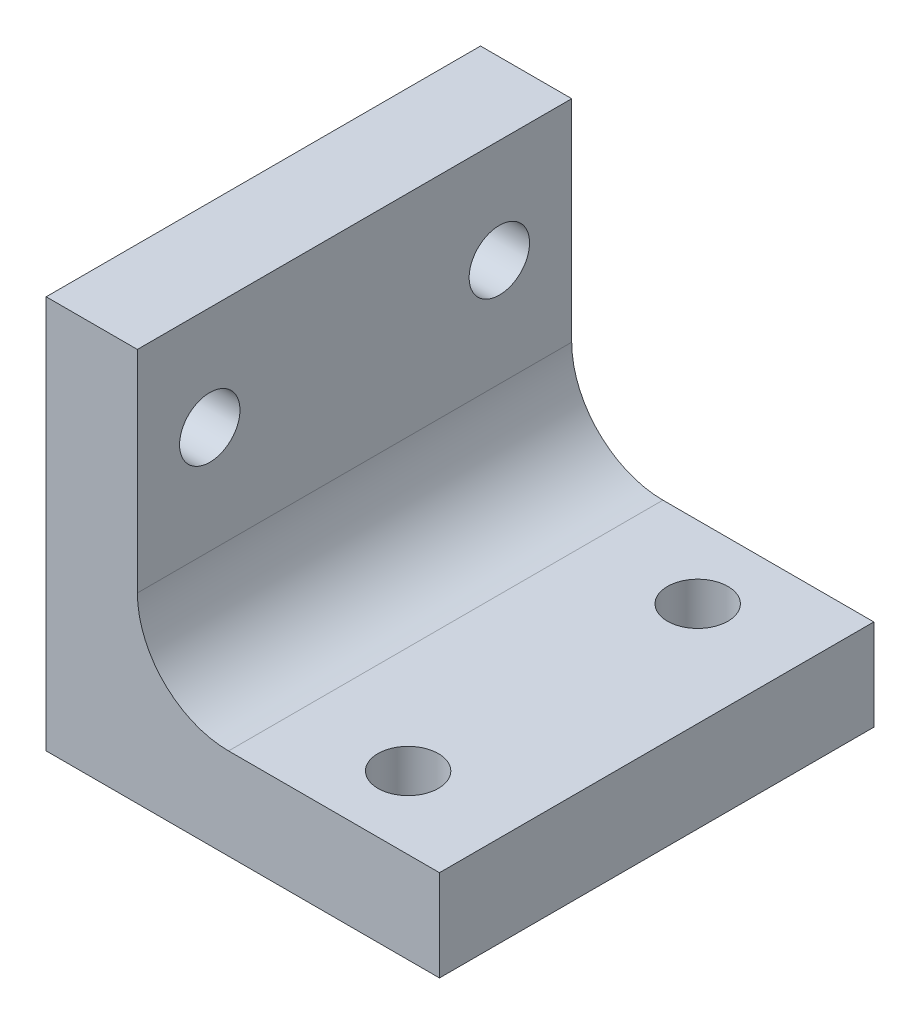
ISO-10303-21;
HEADER;
FILE_DESCRIPTION(('STEP AP214'),'2;1');
FILE_NAME('part.step','',(''),(''),'','','');
FILE_SCHEMA(('AUTOMOTIVE_DESIGN { 1 0 10303 214 1 1 1 1 }'));
ENDSEC;
DATA;
#1=APPLICATION_CONTEXT('core data for automotive mechanical design processes');
#2=APPLICATION_PROTOCOL_DEFINITION('international standard','automotive_design',2000,#1);
#3=PRODUCT_CONTEXT('',#1,'mechanical');
#4=PRODUCT('Part','Part','',(#3));
#5=PRODUCT_RELATED_PRODUCT_CATEGORY('part','',(#4));
#6=PRODUCT_DEFINITION_FORMATION('','',#4);
#7=PRODUCT_DEFINITION_CONTEXT('part definition',#1,'design');
#8=PRODUCT_DEFINITION('design','',#6,#7);
#9=PRODUCT_DEFINITION_SHAPE('','',#8);
#10=(LENGTH_UNIT() NAMED_UNIT(*) SI_UNIT(.MILLI.,.METRE.));
#11=(NAMED_UNIT(*) PLANE_ANGLE_UNIT() SI_UNIT($,.RADIAN.));
#12=(NAMED_UNIT(*) SI_UNIT($,.STERADIAN.) SOLID_ANGLE_UNIT());
#13=UNCERTAINTY_MEASURE_WITH_UNIT(LENGTH_MEASURE(1.E-05),#10,'distance_accuracy_value','');
#14=(GEOMETRIC_REPRESENTATION_CONTEXT(3) GLOBAL_UNCERTAINTY_ASSIGNED_CONTEXT((#13)) GLOBAL_UNIT_ASSIGNED_CONTEXT((#10,
#11,#12)) REPRESENTATION_CONTEXT('',''));
#15=CARTESIAN_POINT('',(0.,0.,0.));
#16=DIRECTION('',(0.,0.,1.));
#17=DIRECTION('',(1.,0.,0.));
#18=AXIS2_PLACEMENT_3D('',#15,#16,#17);
#19=CARTESIAN_POINT('',(0.,0.,19.05));
#20=DIRECTION('',(0.,1.,0.));
#21=DIRECTION('',(0.,0.,1.));
#22=AXIS2_PLACEMENT_3D('',#19,#20,#21);
#23=PLANE('',#22);
#24=CARTESIAN_POINT('',(25.4,0.,-12.7));
#25=DIRECTION('',(0.,1.,0.));
#26=DIRECTION('',(0.,0.,1.));
#27=AXIS2_PLACEMENT_3D('',#24,#25,#26);
#28=CIRCLE('',#27,2.65);
#29=CARTESIAN_POINT('',(25.4,0.,-10.05));
#30=VERTEX_POINT('',#29);
#31=EDGE_CURVE('E137',#30,#30,#28,.T.);
#32=ORIENTED_EDGE('',*,*,#31,.T.);
#33=EDGE_LOOP('',(#32));
#34=FACE_BOUND('',#33,.T.);
#35=CARTESIAN_POINT('',(25.4,0.,12.7));
#36=DIRECTION('',(0.,1.,0.));
#37=DIRECTION('',(0.,0.,1.));
#38=AXIS2_PLACEMENT_3D('',#35,#36,#37);
#39=CIRCLE('',#38,2.65);
#40=CARTESIAN_POINT('',(25.4,0.,15.35));
#41=VERTEX_POINT('',#40);
#42=EDGE_CURVE('E143',#41,#41,#39,.T.);
#43=ORIENTED_EDGE('',*,*,#42,.T.);
#44=EDGE_LOOP('',(#43));
#45=FACE_BOUND('',#44,.T.);
#46=DIRECTION('',(1.,0.,0.));
#47=VECTOR('',#46,1.);
#48=CARTESIAN_POINT('',(0.,0.,-19.05));
#49=LINE('',#48,#47);
#50=CARTESIAN_POINT('',(0.,0.,-19.05));
#51=VERTEX_POINT('',#50);
#52=CARTESIAN_POINT('',(34.5,0.,-19.05));
#53=VERTEX_POINT('',#52);
#54=EDGE_CURVE('E146',#51,#53,#49,.T.);
#55=ORIENTED_EDGE('',*,*,#54,.T.);
#56=DIRECTION('',(0.,0.,-1.));
#57=VECTOR('',#56,1.);
#58=CARTESIAN_POINT('',(34.5,0.,19.05));
#59=LINE('',#58,#57);
#60=CARTESIAN_POINT('',(34.5,0.,19.05));
#61=VERTEX_POINT('',#60);
#62=EDGE_CURVE('E161',#61,#53,#59,.T.);
#63=ORIENTED_EDGE('',*,*,#62,.F.);
#64=DIRECTION('',(1.,0.,0.));
#65=VECTOR('',#64,1.);
#66=CARTESIAN_POINT('',(0.,0.,19.05));
#67=LINE('',#66,#65);
#68=CARTESIAN_POINT('',(0.,0.,19.05));
#69=VERTEX_POINT('',#68);
#70=EDGE_CURVE('E147',#69,#61,#67,.T.);
#71=ORIENTED_EDGE('',*,*,#70,.F.);
#72=DIRECTION('',(0.,0.,-1.));
#73=VECTOR('',#72,1.);
#74=CARTESIAN_POINT('',(0.,0.,19.05));
#75=LINE('',#74,#73);
#76=EDGE_CURVE('E116',#69,#51,#75,.T.);
#77=ORIENTED_EDGE('',*,*,#76,.T.);
#78=EDGE_LOOP('',(#55,#63,#71,#77));
#79=FACE_BOUND('',#78,.T.);
#80=ADVANCED_FACE('F37',(#34,#45,#79),#23,.F.);
#81=CARTESIAN_POINT('',(34.5,0.,19.05));
#82=DIRECTION('',(-1.,0.,0.));
#83=DIRECTION('',(0.,0.,1.));
#84=AXIS2_PLACEMENT_3D('',#81,#82,#83);
#85=PLANE('',#84);
#86=DIRECTION('',(0.,1.,0.));
#87=VECTOR('',#86,1.);
#88=CARTESIAN_POINT('',(34.5,0.,-19.05));
#89=LINE('',#88,#87);
#90=CARTESIAN_POINT('',(34.5,8.,-19.05));
#91=VERTEX_POINT('',#90);
#92=EDGE_CURVE('E156',#53,#91,#89,.T.);
#93=ORIENTED_EDGE('',*,*,#92,.T.);
#94=DIRECTION('',(0.,0.,-1.));
#95=VECTOR('',#94,1.);
#96=CARTESIAN_POINT('',(34.5,8.,19.05));
#97=LINE('',#96,#95);
#98=CARTESIAN_POINT('',(34.5,8.,19.05));
#99=VERTEX_POINT('',#98);
#100=EDGE_CURVE('E154',#99,#91,#97,.T.);
#101=ORIENTED_EDGE('',*,*,#100,.F.);
#102=DIRECTION('',(0.,1.,0.));
#103=VECTOR('',#102,1.);
#104=CARTESIAN_POINT('',(34.5,0.,19.05));
#105=LINE('',#104,#103);
#106=EDGE_CURVE('E149',#61,#99,#105,.T.);
#107=ORIENTED_EDGE('',*,*,#106,.F.);
#108=ORIENTED_EDGE('',*,*,#62,.T.);
#109=EDGE_LOOP('',(#93,#101,#107,#108));
#110=FACE_BOUND('',#109,.T.);
#111=ADVANCED_FACE('F179',(#110),#85,.F.);
#112=CARTESIAN_POINT('',(34.5,8.,19.05));
#113=DIRECTION('',(0.,-1.,0.));
#114=DIRECTION('',(1.,0.,0.));
#115=AXIS2_PLACEMENT_3D('',#112,#113,#114);
#116=PLANE('',#115);
#117=CARTESIAN_POINT('',(25.4,8.,-12.7));
#118=DIRECTION('',(0.,1.,0.));
#119=DIRECTION('',(0.,0.,1.));
#120=AXIS2_PLACEMENT_3D('',#117,#118,#119);
#121=CIRCLE('',#120,2.65);
#122=CARTESIAN_POINT('',(25.4,8.,-10.05));
#123=VERTEX_POINT('',#122);
#124=EDGE_CURVE('E134',#123,#123,#121,.T.);
#125=ORIENTED_EDGE('',*,*,#124,.F.);
#126=EDGE_LOOP('',(#125));
#127=FACE_BOUND('',#126,.T.);
#128=CARTESIAN_POINT('',(25.4,8.,12.7));
#129=DIRECTION('',(0.,1.,0.));
#130=DIRECTION('',(0.,0.,1.));
#131=AXIS2_PLACEMENT_3D('',#128,#129,#130);
#132=CIRCLE('',#131,2.65);
#133=CARTESIAN_POINT('',(25.4,8.,15.35));
#134=VERTEX_POINT('',#133);
#135=EDGE_CURVE('E140',#134,#134,#132,.T.);
#136=ORIENTED_EDGE('',*,*,#135,.F.);
#137=EDGE_LOOP('',(#136));
#138=FACE_BOUND('',#137,.T.);
#139=DIRECTION('',(-1.,0.,0.));
#140=VECTOR('',#139,1.);
#141=CARTESIAN_POINT('',(34.5,8.,-19.05));
#142=LINE('',#141,#140);
#143=CARTESIAN_POINT('',(16.,8.,-19.05));
#144=VERTEX_POINT('',#143);
#145=EDGE_CURVE('E150',#91,#144,#142,.T.);
#146=ORIENTED_EDGE('',*,*,#145,.T.);
#147=DIRECTION('',(0.,0.,-1.));
#148=VECTOR('',#147,1.);
#149=CARTESIAN_POINT('',(16.,8.,19.05));
#150=LINE('',#149,#148);
#151=CARTESIAN_POINT('',(16.,8.,19.05));
#152=VERTEX_POINT('',#151);
#153=EDGE_CURVE('E52',#144,#152,#150,.F.);
#154=ORIENTED_EDGE('',*,*,#153,.T.);
#155=DIRECTION('',(-1.,0.,0.));
#156=VECTOR('',#155,1.);
#157=CARTESIAN_POINT('',(34.5,8.,19.05));
#158=LINE('',#157,#156);
#159=EDGE_CURVE('E152',#99,#152,#158,.T.);
#160=ORIENTED_EDGE('',*,*,#159,.F.);
#161=ORIENTED_EDGE('',*,*,#100,.T.);
#162=EDGE_LOOP('',(#146,#154,#160,#161));
#163=FACE_BOUND('',#162,.T.);
#164=ADVANCED_FACE('F180',(#127,#138,#163),#116,.F.);
#165=CARTESIAN_POINT('',(0.,0.,19.05));
#166=DIRECTION('',(0.,0.,1.));
#167=DIRECTION('',(1.,0.,0.));
#168=AXIS2_PLACEMENT_3D('',#165,#166,#167);
#169=PLANE('',#168);
#170=ORIENTED_EDGE('',*,*,#159,.T.);
#171=CARTESIAN_POINT('',(16.,16.,19.05));
#172=DIRECTION('',(0.,0.,1.));
#173=DIRECTION('',(1.,0.,0.));
#174=AXIS2_PLACEMENT_3D('',#171,#172,#173);
#175=CIRCLE('',#174,8.);
#176=CARTESIAN_POINT('',(8.,16.,19.05));
#177=VERTEX_POINT('',#176);
#178=EDGE_CURVE('E11',#152,#177,#175,.F.);
#179=ORIENTED_EDGE('',*,*,#178,.T.);
#180=DIRECTION('',(0.,-1.,0.));
#181=VECTOR('',#180,1.);
#182=CARTESIAN_POINT('',(8.00000000000001,34.5,19.05));
#183=LINE('',#182,#181);
#184=CARTESIAN_POINT('',(8.00000000000001,34.5,19.05));
#185=VERTEX_POINT('',#184);
#186=EDGE_CURVE('E103',#185,#177,#183,.T.);
#187=ORIENTED_EDGE('',*,*,#186,.F.);
#188=DIRECTION('',(1.,0.,0.));
#189=VECTOR('',#188,1.);
#190=CARTESIAN_POINT('',(0.,34.5,19.05));
#191=LINE('',#190,#189);
#192=CARTESIAN_POINT('',(0.,34.5,19.05));
#193=VERTEX_POINT('',#192);
#194=EDGE_CURVE('E96',#193,#185,#191,.T.);
#195=ORIENTED_EDGE('',*,*,#194,.F.);
#196=DIRECTION('',(0.,1.,0.));
#197=VECTOR('',#196,1.);
#198=CARTESIAN_POINT('',(0.,0.,19.05));
#199=LINE('',#198,#197);
#200=EDGE_CURVE('E100',#69,#193,#199,.T.);
#201=ORIENTED_EDGE('',*,*,#200,.F.);
#202=ORIENTED_EDGE('',*,*,#70,.T.);
#203=ORIENTED_EDGE('',*,*,#106,.T.);
#204=EDGE_LOOP('',(#170,#179,#187,#195,#201,#202,#203));
#205=FACE_BOUND('',#204,.T.);
#206=ADVANCED_FACE('F98',(#205),#169,.T.);
#207=CARTESIAN_POINT('',(0.,0.,-19.05));
#208=DIRECTION('',(0.,0.,1.));
#209=DIRECTION('',(1.,0.,0.));
#210=AXIS2_PLACEMENT_3D('',#207,#208,#209);
#211=PLANE('',#210);
#212=ORIENTED_EDGE('',*,*,#54,.F.);
#213=DIRECTION('',(0.,1.,0.));
#214=VECTOR('',#213,1.);
#215=CARTESIAN_POINT('',(0.,0.,-19.05));
#216=LINE('',#215,#214);
#217=CARTESIAN_POINT('',(0.,34.5,-19.05));
#218=VERTEX_POINT('',#217);
#219=EDGE_CURVE('E129',#51,#218,#216,.T.);
#220=ORIENTED_EDGE('',*,*,#219,.T.);
#221=DIRECTION('',(1.,0.,0.));
#222=VECTOR('',#221,1.);
#223=CARTESIAN_POINT('',(0.,34.5,-19.05));
#224=LINE('',#223,#222);
#225=CARTESIAN_POINT('',(8.00000000000001,34.5,-19.05));
#226=VERTEX_POINT('',#225);
#227=EDGE_CURVE('E112',#218,#226,#224,.T.);
#228=ORIENTED_EDGE('',*,*,#227,.T.);
#229=DIRECTION('',(0.,-1.,0.));
#230=VECTOR('',#229,1.);
#231=CARTESIAN_POINT('',(8.00000000000001,34.5,-19.05));
#232=LINE('',#231,#230);
#233=CARTESIAN_POINT('',(8.,16.,-19.05));
#234=VERTEX_POINT('',#233);
#235=EDGE_CURVE('E121',#226,#234,#232,.T.);
#236=ORIENTED_EDGE('',*,*,#235,.T.);
#237=CARTESIAN_POINT('',(16.,16.,-19.05));
#238=DIRECTION('',(0.,0.,1.));
#239=DIRECTION('',(1.,0.,0.));
#240=AXIS2_PLACEMENT_3D('',#237,#238,#239);
#241=CIRCLE('',#240,8.);
#242=EDGE_CURVE('E45',#234,#144,#241,.T.);
#243=ORIENTED_EDGE('',*,*,#242,.T.);
#244=ORIENTED_EDGE('',*,*,#145,.F.);
#245=ORIENTED_EDGE('',*,*,#92,.F.);
#246=EDGE_LOOP('',(#212,#220,#228,#236,#243,#244,#245));
#247=FACE_BOUND('',#246,.T.);
#248=ADVANCED_FACE('F172',(#247),#211,.F.);
#249=CARTESIAN_POINT('',(25.4,8.,12.7));
#250=DIRECTION('',(0.,1.,0.));
#251=DIRECTION('',(0.,0.,1.));
#252=AXIS2_PLACEMENT_3D('',#249,#250,#251);
#253=CYLINDRICAL_SURFACE('',#252,2.65);
#254=ORIENTED_EDGE('',*,*,#42,.F.);
#255=EDGE_LOOP('',(#254));
#256=FACE_BOUND('',#255,.T.);
#257=ORIENTED_EDGE('',*,*,#135,.T.);
#258=EDGE_LOOP('',(#257));
#259=FACE_BOUND('',#258,.T.);
#260=ADVANCED_FACE('F201',(#256,#259),#253,.F.);
#261=CARTESIAN_POINT('',(25.4,8.,-12.7));
#262=DIRECTION('',(0.,1.,0.));
#263=DIRECTION('',(0.,0.,1.));
#264=AXIS2_PLACEMENT_3D('',#261,#262,#263);
#265=CYLINDRICAL_SURFACE('',#264,2.65);
#266=ORIENTED_EDGE('',*,*,#31,.F.);
#267=EDGE_LOOP('',(#266));
#268=FACE_BOUND('',#267,.T.);
#269=ORIENTED_EDGE('',*,*,#124,.T.);
#270=EDGE_LOOP('',(#269));
#271=FACE_BOUND('',#270,.T.);
#272=ADVANCED_FACE('F204',(#268,#271),#265,.F.);
#273=CARTESIAN_POINT('',(0.,0.,19.05));
#274=DIRECTION('',(1.,0.,0.));
#275=DIRECTION('',(0.,0.,1.));
#276=AXIS2_PLACEMENT_3D('',#273,#274,#275);
#277=PLANE('',#276);
#278=CARTESIAN_POINT('',(0.,25.4,-12.7));
#279=DIRECTION('',(-1.,0.,0.));
#280=DIRECTION('',(0.,0.,1.));
#281=AXIS2_PLACEMENT_3D('',#278,#279,#280);
#282=CIRCLE('',#281,2.65);
#283=CARTESIAN_POINT('',(0.,25.4,-10.05));
#284=VERTEX_POINT('',#283);
#285=EDGE_CURVE('E235',#284,#284,#282,.T.);
#286=ORIENTED_EDGE('',*,*,#285,.F.);
#287=EDGE_LOOP('',(#286));
#288=FACE_BOUND('',#287,.T.);
#289=CARTESIAN_POINT('',(0.,25.4,12.7));
#290=DIRECTION('',(-1.,0.,0.));
#291=DIRECTION('',(0.,0.,1.));
#292=AXIS2_PLACEMENT_3D('',#289,#290,#291);
#293=CIRCLE('',#292,2.65);
#294=CARTESIAN_POINT('',(0.,25.4,15.35));
#295=VERTEX_POINT('',#294);
#296=EDGE_CURVE('E125',#295,#295,#293,.T.);
#297=ORIENTED_EDGE('',*,*,#296,.F.);
#298=EDGE_LOOP('',(#297));
#299=FACE_BOUND('',#298,.T.);
#300=ORIENTED_EDGE('',*,*,#219,.F.);
#301=ORIENTED_EDGE('',*,*,#76,.F.);
#302=ORIENTED_EDGE('',*,*,#200,.T.);
#303=DIRECTION('',(0.,0.,-1.));
#304=VECTOR('',#303,1.);
#305=CARTESIAN_POINT('',(0.,34.5,19.05));
#306=LINE('',#305,#304);
#307=EDGE_CURVE('E109',#193,#218,#306,.T.);
#308=ORIENTED_EDGE('',*,*,#307,.T.);
#309=EDGE_LOOP('',(#300,#301,#302,#308));
#310=FACE_BOUND('',#309,.T.);
#311=ADVANCED_FACE('F119',(#288,#299,#310),#277,.F.);
#312=CARTESIAN_POINT('',(0.,34.5,19.05));
#313=DIRECTION('',(0.,-1.,0.));
#314=DIRECTION('',(0.,0.,1.));
#315=AXIS2_PLACEMENT_3D('',#312,#313,#314);
#316=PLANE('',#315);
#317=ORIENTED_EDGE('',*,*,#227,.F.);
#318=ORIENTED_EDGE('',*,*,#307,.F.);
#319=ORIENTED_EDGE('',*,*,#194,.T.);
#320=DIRECTION('',(0.,0.,-1.));
#321=VECTOR('',#320,1.);
#322=CARTESIAN_POINT('',(8.00000000000001,34.5,19.05));
#323=LINE('',#322,#321);
#324=EDGE_CURVE('E117',#185,#226,#323,.T.);
#325=ORIENTED_EDGE('',*,*,#324,.T.);
#326=EDGE_LOOP('',(#317,#318,#319,#325));
#327=FACE_BOUND('',#326,.T.);
#328=ADVANCED_FACE('F110',(#327),#316,.F.);
#329=CARTESIAN_POINT('',(8.00000000000001,34.5,19.05));
#330=DIRECTION('',(-1.,0.,0.));
#331=DIRECTION('',(0.,1.,0.));
#332=AXIS2_PLACEMENT_3D('',#329,#330,#331);
#333=PLANE('',#332);
#334=CARTESIAN_POINT('',(8.,25.4,-12.7));
#335=DIRECTION('',(-1.,0.,0.));
#336=DIRECTION('',(0.,0.,1.));
#337=AXIS2_PLACEMENT_3D('',#334,#335,#336);
#338=CIRCLE('',#337,2.65);
#339=CARTESIAN_POINT('',(8.,25.4,-10.05));
#340=VERTEX_POINT('',#339);
#341=EDGE_CURVE('E238',#340,#340,#338,.T.);
#342=ORIENTED_EDGE('',*,*,#341,.T.);
#343=EDGE_LOOP('',(#342));
#344=FACE_BOUND('',#343,.T.);
#345=CARTESIAN_POINT('',(8.,25.4,12.7));
#346=DIRECTION('',(-1.,0.,0.));
#347=DIRECTION('',(0.,0.,1.));
#348=AXIS2_PLACEMENT_3D('',#345,#346,#347);
#349=CIRCLE('',#348,2.65);
#350=CARTESIAN_POINT('',(8.,25.4,15.35));
#351=VERTEX_POINT('',#350);
#352=EDGE_CURVE('E240',#351,#351,#349,.T.);
#353=ORIENTED_EDGE('',*,*,#352,.T.);
#354=EDGE_LOOP('',(#353));
#355=FACE_BOUND('',#354,.T.);
#356=ORIENTED_EDGE('',*,*,#186,.T.);
#357=DIRECTION('',(0.,0.,-1.));
#358=VECTOR('',#357,1.);
#359=CARTESIAN_POINT('',(7.99999999999999,16.,-19.05));
#360=LINE('',#359,#358);
#361=EDGE_CURVE('E164',#177,#234,#360,.T.);
#362=ORIENTED_EDGE('',*,*,#361,.T.);
#363=ORIENTED_EDGE('',*,*,#235,.F.);
#364=ORIENTED_EDGE('',*,*,#324,.F.);
#365=EDGE_LOOP('',(#356,#362,#363,#364));
#366=FACE_BOUND('',#365,.T.);
#367=ADVANCED_FACE('F169',(#344,#355,#366),#333,.F.);
#368=CARTESIAN_POINT('',(8.,25.4,12.7));
#369=DIRECTION('',(1.,0.,0.));
#370=DIRECTION('',(0.,0.,1.));
#371=AXIS2_PLACEMENT_3D('',#368,#369,#370);
#372=CYLINDRICAL_SURFACE('',#371,2.65);
#373=ORIENTED_EDGE('',*,*,#296,.T.);
#374=EDGE_LOOP('',(#373));
#375=FACE_BOUND('',#374,.T.);
#376=ORIENTED_EDGE('',*,*,#352,.F.);
#377=EDGE_LOOP('',(#376));
#378=FACE_BOUND('',#377,.T.);
#379=ADVANCED_FACE('F221',(#375,#378),#372,.F.);
#380=CARTESIAN_POINT('',(8.,25.4,-12.7));
#381=DIRECTION('',(1.,0.,0.));
#382=DIRECTION('',(0.,0.,1.));
#383=AXIS2_PLACEMENT_3D('',#380,#381,#382);
#384=CYLINDRICAL_SURFACE('',#383,2.65);
#385=ORIENTED_EDGE('',*,*,#285,.T.);
#386=EDGE_LOOP('',(#385));
#387=FACE_BOUND('',#386,.T.);
#388=ORIENTED_EDGE('',*,*,#341,.F.);
#389=EDGE_LOOP('',(#388));
#390=FACE_BOUND('',#389,.T.);
#391=ADVANCED_FACE('F225',(#387,#390),#384,.F.);
#392=CARTESIAN_POINT('',(16.,16.,19.05));
#393=DIRECTION('',(0.,0.,1.));
#394=DIRECTION('',(1.,0.,0.));
#395=AXIS2_PLACEMENT_3D('',#392,#393,#394);
#396=CYLINDRICAL_SURFACE('',#395,8.);
#397=ORIENTED_EDGE('',*,*,#178,.F.);
#398=ORIENTED_EDGE('',*,*,#153,.F.);
#399=ORIENTED_EDGE('',*,*,#242,.F.);
#400=ORIENTED_EDGE('',*,*,#361,.F.);
#401=EDGE_LOOP('',(#397,#398,#399,#400));
#402=FACE_BOUND('',#401,.T.);
#403=ADVANCED_FACE('F39',(#402),#396,.F.);
#404=CLOSED_SHELL('',(#80,#111,#164,#206,#248,#260,#272,#311,#328,#367,#379,#391,#403));
#405=MANIFOLD_SOLID_BREP('B2',#404);
#406=ADVANCED_BREP_SHAPE_REPRESENTATION('',(#18,#405),#14);
#407=SHAPE_DEFINITION_REPRESENTATION(#9,#406);
ENDSEC;
END-ISO-10303-21;
